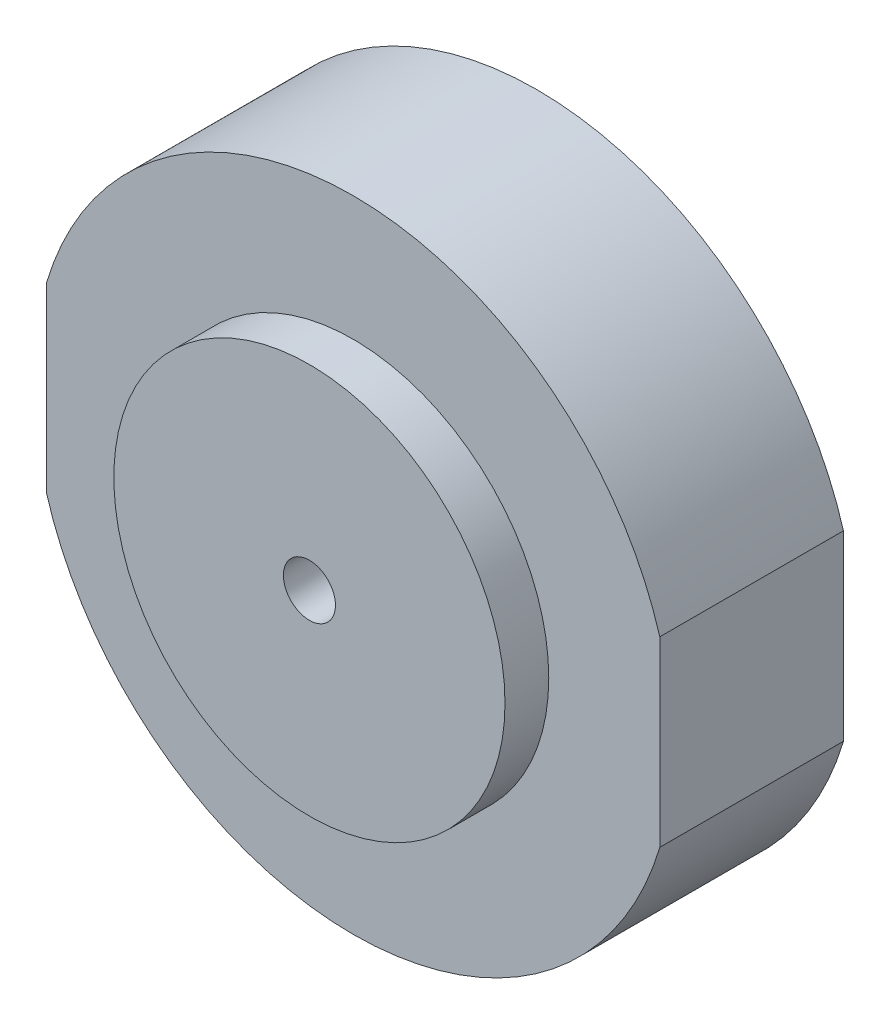
ISO-10303-21;
HEADER;
FILE_DESCRIPTION(('STEP AP214'),'2;1');
FILE_NAME('part.step','',(''),(''),'','','');
FILE_SCHEMA(('AUTOMOTIVE_DESIGN { 1 0 10303 214 1 1 1 1 }'));
ENDSEC;
DATA;
#1=APPLICATION_CONTEXT('core data for automotive mechanical design processes');
#2=APPLICATION_PROTOCOL_DEFINITION('international standard','automotive_design',2000,#1);
#3=PRODUCT_CONTEXT('',#1,'mechanical');
#4=PRODUCT('Part','Part','',(#3));
#5=PRODUCT_RELATED_PRODUCT_CATEGORY('part','',(#4));
#6=PRODUCT_DEFINITION_FORMATION('','',#4);
#7=PRODUCT_DEFINITION_CONTEXT('part definition',#1,'design');
#8=PRODUCT_DEFINITION('design','',#6,#7);
#9=PRODUCT_DEFINITION_SHAPE('','',#8);
#10=(LENGTH_UNIT() NAMED_UNIT(*) SI_UNIT(.MILLI.,.METRE.));
#11=(NAMED_UNIT(*) PLANE_ANGLE_UNIT() SI_UNIT($,.RADIAN.));
#12=(NAMED_UNIT(*) SI_UNIT($,.STERADIAN.) SOLID_ANGLE_UNIT());
#13=UNCERTAINTY_MEASURE_WITH_UNIT(LENGTH_MEASURE(1.E-05),#10,'distance_accuracy_value','');
#14=(GEOMETRIC_REPRESENTATION_CONTEXT(3) GLOBAL_UNCERTAINTY_ASSIGNED_CONTEXT((#13)) GLOBAL_UNIT_ASSIGNED_CONTEXT((#10,
#11,#12)) REPRESENTATION_CONTEXT('',''));
#15=CARTESIAN_POINT('',(0.,0.,0.));
#16=DIRECTION('',(0.,0.,1.));
#17=DIRECTION('',(1.,0.,0.));
#18=AXIS2_PLACEMENT_3D('',#15,#16,#17);
#19=CARTESIAN_POINT('',(0.,0.,-27.7));
#20=DIRECTION('',(0.,0.,1.));
#21=DIRECTION('',(1.,0.,0.));
#22=AXIS2_PLACEMENT_3D('',#19,#20,#21);
#23=CYLINDRICAL_SURFACE('',#22,48.25);
#24=DIRECTION('',(0.,0.,1.));
#25=VECTOR('',#24,1.);
#26=CARTESIAN_POINT('',(-46.25,13.7477270848675,-27.7));
#27=LINE('',#26,#25);
#28=CARTESIAN_POINT('',(-46.25,13.7477270848675,0.));
#29=VERTEX_POINT('',#28);
#30=CARTESIAN_POINT('',(-46.25,13.7477270848675,-27.7));
#31=VERTEX_POINT('',#30);
#32=EDGE_CURVE('E116',#29,#31,#27,.F.);
#33=ORIENTED_EDGE('',*,*,#32,.F.);
#34=CARTESIAN_POINT('',(0.,0.,0.));
#35=DIRECTION('',(0.,0.,1.));
#36=DIRECTION('',(1.,0.,0.));
#37=AXIS2_PLACEMENT_3D('',#34,#35,#36);
#38=CIRCLE('',#37,48.25);
#39=CARTESIAN_POINT('',(46.25,13.7477270848676,0.));
#40=VERTEX_POINT('',#39);
#41=EDGE_CURVE('E95',#40,#29,#38,.T.);
#42=ORIENTED_EDGE('',*,*,#41,.F.);
#43=DIRECTION('',(0.,0.,1.));
#44=VECTOR('',#43,1.);
#45=CARTESIAN_POINT('',(46.25,13.7477270848676,-27.7));
#46=LINE('',#45,#44);
#47=CARTESIAN_POINT('',(46.25,13.7477270848676,-27.7));
#48=VERTEX_POINT('',#47);
#49=EDGE_CURVE('E61',#48,#40,#46,.T.);
#50=ORIENTED_EDGE('',*,*,#49,.F.);
#51=CARTESIAN_POINT('',(0.,0.,-27.7));
#52=DIRECTION('',(0.,0.,1.));
#53=DIRECTION('',(1.,0.,0.));
#54=AXIS2_PLACEMENT_3D('',#51,#52,#53);
#55=CIRCLE('',#54,48.25);
#56=EDGE_CURVE('E102',#48,#31,#55,.T.);
#57=ORIENTED_EDGE('',*,*,#56,.T.);
#58=EDGE_LOOP('',(#33,#42,#50,#57));
#59=FACE_BOUND('',#58,.T.);
#60=ADVANCED_FACE('F39',(#59),#23,.T.);
#61=DIRECTION('',(0.,0.,1.));
#62=VECTOR('',#61,1.);
#63=CARTESIAN_POINT('',(-46.25,-13.7477270848676,-27.7));
#64=LINE('',#63,#62);
#65=CARTESIAN_POINT('',(-46.25,-13.7477270848676,-27.7));
#66=VERTEX_POINT('',#65);
#67=CARTESIAN_POINT('',(-46.25,-13.7477270848676,0.));
#68=VERTEX_POINT('',#67);
#69=EDGE_CURVE('E53',#66,#68,#64,.T.);
#70=ORIENTED_EDGE('',*,*,#69,.F.);
#71=CARTESIAN_POINT('',(46.25,-13.7477270848675,-27.7));
#72=VERTEX_POINT('',#71);
#73=EDGE_CURVE('E90',#66,#72,#55,.T.);
#74=ORIENTED_EDGE('',*,*,#73,.T.);
#75=DIRECTION('',(0.,0.,1.));
#76=VECTOR('',#75,1.);
#77=CARTESIAN_POINT('',(46.25,-13.7477270848675,-27.7));
#78=LINE('',#77,#76);
#79=CARTESIAN_POINT('',(46.25,-13.7477270848675,0.));
#80=VERTEX_POINT('',#79);
#81=EDGE_CURVE('E78',#80,#72,#78,.F.);
#82=ORIENTED_EDGE('',*,*,#81,.F.);
#83=EDGE_CURVE('E88',#68,#80,#38,.T.);
#84=ORIENTED_EDGE('',*,*,#83,.F.);
#85=EDGE_LOOP('',(#70,#74,#82,#84));
#86=FACE_BOUND('',#85,.T.);
#87=ADVANCED_FACE('F41',(#86),#23,.T.);
#88=CARTESIAN_POINT('',(0.,0.,-27.7));
#89=DIRECTION('',(0.,0.,1.));
#90=DIRECTION('',(1.,0.,0.));
#91=AXIS2_PLACEMENT_3D('',#88,#89,#90);
#92=PLANE('',#91);
#93=CARTESIAN_POINT('',(0.,0.,-27.7));
#94=DIRECTION('',(0.,0.,-1.));
#95=DIRECTION('',(-1.,0.,0.));
#96=AXIS2_PLACEMENT_3D('',#93,#94,#95);
#97=CIRCLE('',#96,29.);
#98=CARTESIAN_POINT('',(-29.,0.,-27.7));
#99=VERTEX_POINT('',#98);
#100=EDGE_CURVE('E84',#99,#99,#97,.T.);
#101=ORIENTED_EDGE('',*,*,#100,.F.);
#102=EDGE_LOOP('',(#101));
#103=FACE_BOUND('',#102,.T.);
#104=ORIENTED_EDGE('',*,*,#73,.F.);
#105=DIRECTION('',(0.,1.,0.));
#106=VECTOR('',#105,1.);
#107=CARTESIAN_POINT('',(-46.25,0.,-27.7));
#108=LINE('',#107,#106);
#109=EDGE_CURVE('E91',#66,#31,#108,.T.);
#110=ORIENTED_EDGE('',*,*,#109,.T.);
#111=ORIENTED_EDGE('',*,*,#56,.F.);
#112=DIRECTION('',(0.,-1.,0.));
#113=VECTOR('',#112,1.);
#114=CARTESIAN_POINT('',(46.25,0.,-27.7));
#115=LINE('',#114,#113);
#116=EDGE_CURVE('E124',#48,#72,#115,.T.);
#117=ORIENTED_EDGE('',*,*,#116,.T.);
#118=EDGE_LOOP('',(#104,#110,#111,#117));
#119=FACE_BOUND('',#118,.T.);
#120=ADVANCED_FACE('F127',(#103,#119),#92,.F.);
#121=CARTESIAN_POINT('',(0.,0.,0.));
#122=DIRECTION('',(0.,0.,1.));
#123=DIRECTION('',(1.,0.,0.));
#124=AXIS2_PLACEMENT_3D('',#121,#122,#123);
#125=PLANE('',#124);
#126=DIRECTION('',(0.,1.,0.));
#127=VECTOR('',#126,1.);
#128=CARTESIAN_POINT('',(-46.25,0.,0.));
#129=LINE('',#128,#127);
#130=EDGE_CURVE('E11',#68,#29,#129,.T.);
#131=ORIENTED_EDGE('',*,*,#130,.F.);
#132=ORIENTED_EDGE('',*,*,#83,.T.);
#133=DIRECTION('',(0.,-1.,0.));
#134=VECTOR('',#133,1.);
#135=CARTESIAN_POINT('',(46.25,0.,0.));
#136=LINE('',#135,#134);
#137=EDGE_CURVE('E47',#40,#80,#136,.T.);
#138=ORIENTED_EDGE('',*,*,#137,.F.);
#139=ORIENTED_EDGE('',*,*,#41,.T.);
#140=EDGE_LOOP('',(#131,#132,#138,#139));
#141=FACE_BOUND('',#140,.T.);
#142=CARTESIAN_POINT('',(0.,0.,0.));
#143=DIRECTION('',(0.,0.,1.));
#144=DIRECTION('',(1.,0.,0.));
#145=AXIS2_PLACEMENT_3D('',#142,#143,#144);
#146=CIRCLE('',#145,29.5);
#147=CARTESIAN_POINT('',(29.5,0.,0.));
#148=VERTEX_POINT('',#147);
#149=EDGE_CURVE('E105',#148,#148,#146,.T.);
#150=ORIENTED_EDGE('',*,*,#149,.F.);
#151=EDGE_LOOP('',(#150));
#152=FACE_BOUND('',#151,.T.);
#153=ADVANCED_FACE('F93',(#141,#152),#125,.T.);
#154=CARTESIAN_POINT('',(0.,0.,6.6));
#155=DIRECTION('',(0.,0.,-1.));
#156=DIRECTION('',(-1.,0.,0.));
#157=AXIS2_PLACEMENT_3D('',#154,#155,#156);
#158=CYLINDRICAL_SURFACE('',#157,29.5);
#159=CARTESIAN_POINT('',(0.,0.,6.6));
#160=DIRECTION('',(0.,0.,1.));
#161=DIRECTION('',(1.,0.,0.));
#162=AXIS2_PLACEMENT_3D('',#159,#160,#161);
#163=CIRCLE('',#162,29.5);
#164=CARTESIAN_POINT('',(29.5,0.,6.6));
#165=VERTEX_POINT('',#164);
#166=EDGE_CURVE('E96',#165,#165,#163,.T.);
#167=ORIENTED_EDGE('',*,*,#166,.F.);
#168=EDGE_LOOP('',(#167));
#169=FACE_BOUND('',#168,.T.);
#170=ORIENTED_EDGE('',*,*,#149,.T.);
#171=EDGE_LOOP('',(#170));
#172=FACE_BOUND('',#171,.T.);
#173=ADVANCED_FACE('F151',(#169,#172),#158,.T.);
#174=CARTESIAN_POINT('',(0.,0.,6.6));
#175=DIRECTION('',(0.,0.,1.));
#176=DIRECTION('',(1.,0.,0.));
#177=AXIS2_PLACEMENT_3D('',#174,#175,#176);
#178=PLANE('',#177);
#179=CARTESIAN_POINT('',(0.,0.,6.6));
#180=DIRECTION('',(0.,0.,1.));
#181=DIRECTION('',(1.,0.,0.));
#182=AXIS2_PLACEMENT_3D('',#179,#180,#181);
#183=CIRCLE('',#182,3.92490336427357);
#184=CARTESIAN_POINT('',(3.92490336427357,0.,6.6));
#185=VERTEX_POINT('',#184);
#186=EDGE_CURVE('E113',#185,#185,#183,.T.);
#187=ORIENTED_EDGE('',*,*,#186,.F.);
#188=EDGE_LOOP('',(#187));
#189=FACE_BOUND('',#188,.T.);
#190=ORIENTED_EDGE('',*,*,#166,.T.);
#191=EDGE_LOOP('',(#190));
#192=FACE_BOUND('',#191,.T.);
#193=ADVANCED_FACE('F156',(#189,#192),#178,.T.);
#194=CARTESIAN_POINT('',(0.,0.,-35.7));
#195=DIRECTION('',(0.,0.,1.));
#196=DIRECTION('',(1.,0.,0.));
#197=AXIS2_PLACEMENT_3D('',#194,#195,#196);
#198=CYLINDRICAL_SURFACE('',#197,29.);
#199=CARTESIAN_POINT('',(0.,0.,-35.7));
#200=DIRECTION('',(0.,0.,-1.));
#201=DIRECTION('',(-1.,0.,0.));
#202=AXIS2_PLACEMENT_3D('',#199,#200,#201);
#203=CIRCLE('',#202,29.);
#204=CARTESIAN_POINT('',(-29.,0.,-35.7));
#205=VERTEX_POINT('',#204);
#206=EDGE_CURVE('E99',#205,#205,#203,.T.);
#207=ORIENTED_EDGE('',*,*,#206,.F.);
#208=EDGE_LOOP('',(#207));
#209=FACE_BOUND('',#208,.T.);
#210=ORIENTED_EDGE('',*,*,#100,.T.);
#211=EDGE_LOOP('',(#210));
#212=FACE_BOUND('',#211,.T.);
#213=ADVANCED_FACE('F160',(#209,#212),#198,.T.);
#214=CARTESIAN_POINT('',(0.,0.,-35.7));
#215=DIRECTION('',(0.,0.,-1.));
#216=DIRECTION('',(-1.,0.,0.));
#217=AXIS2_PLACEMENT_3D('',#214,#215,#216);
#218=PLANE('',#217);
#219=ORIENTED_EDGE('',*,*,#206,.T.);
#220=EDGE_LOOP('',(#219));
#221=FACE_BOUND('',#220,.T.);
#222=ADVANCED_FACE('F164',(#221),#218,.T.);
#223=CARTESIAN_POINT('',(0.,0.,-1.4));
#224=DIRECTION('',(0.,0.,1.));
#225=DIRECTION('',(1.,0.,0.));
#226=AXIS2_PLACEMENT_3D('',#223,#224,#225);
#227=CYLINDRICAL_SURFACE('',#226,3.92490336427357);
#228=CARTESIAN_POINT('',(0.,0.,-1.4));
#229=DIRECTION('',(0.,0.,1.));
#230=DIRECTION('',(1.,0.,0.));
#231=AXIS2_PLACEMENT_3D('',#228,#229,#230);
#232=CIRCLE('',#231,3.92490336427357);
#233=CARTESIAN_POINT('',(3.92490336427357,0.,-1.4));
#234=VERTEX_POINT('',#233);
#235=EDGE_CURVE('E112',#234,#234,#232,.T.);
#236=ORIENTED_EDGE('',*,*,#235,.F.);
#237=EDGE_LOOP('',(#236));
#238=FACE_BOUND('',#237,.T.);
#239=ORIENTED_EDGE('',*,*,#186,.T.);
#240=EDGE_LOOP('',(#239));
#241=FACE_BOUND('',#240,.T.);
#242=ADVANCED_FACE('F168',(#238,#241),#227,.F.);
#243=CARTESIAN_POINT('',(0.,0.,-1.4));
#244=DIRECTION('',(0.,0.,1.));
#245=DIRECTION('',(1.,0.,0.));
#246=AXIS2_PLACEMENT_3D('',#243,#244,#245);
#247=PLANE('',#246);
#248=ORIENTED_EDGE('',*,*,#235,.T.);
#249=EDGE_LOOP('',(#248));
#250=FACE_BOUND('',#249,.T.);
#251=ADVANCED_FACE('F136',(#250),#247,.T.);
#252=CARTESIAN_POINT('',(46.25,38.1751056147458,-39.));
#253=DIRECTION('',(-1.,0.,0.));
#254=DIRECTION('',(0.,-1.,0.));
#255=AXIS2_PLACEMENT_3D('',#252,#253,#254);
#256=PLANE('',#255);
#257=ORIENTED_EDGE('',*,*,#81,.T.);
#258=ORIENTED_EDGE('',*,*,#116,.F.);
#259=ORIENTED_EDGE('',*,*,#49,.T.);
#260=ORIENTED_EDGE('',*,*,#137,.T.);
#261=EDGE_LOOP('',(#257,#258,#259,#260));
#262=FACE_BOUND('',#261,.T.);
#263=ADVANCED_FACE('F77',(#262),#256,.F.);
#264=CARTESIAN_POINT('',(-46.25,33.6706683740678,-39.));
#265=DIRECTION('',(1.,0.,0.));
#266=DIRECTION('',(0.,1.,0.));
#267=AXIS2_PLACEMENT_3D('',#264,#265,#266);
#268=PLANE('',#267);
#269=ORIENTED_EDGE('',*,*,#32,.T.);
#270=ORIENTED_EDGE('',*,*,#109,.F.);
#271=ORIENTED_EDGE('',*,*,#69,.T.);
#272=ORIENTED_EDGE('',*,*,#130,.T.);
#273=EDGE_LOOP('',(#269,#270,#271,#272));
#274=FACE_BOUND('',#273,.T.);
#275=ADVANCED_FACE('F130',(#274),#268,.F.);
#276=CLOSED_SHELL('',(#60,#87,#120,#153,#173,#193,#213,#222,#242,#251,#263,#275));
#277=MANIFOLD_SOLID_BREP('B2',#276);
#278=ADVANCED_BREP_SHAPE_REPRESENTATION('',(#18,#277),#14);
#279=SHAPE_DEFINITION_REPRESENTATION(#9,#278);
ENDSEC;
END-ISO-10303-21;
